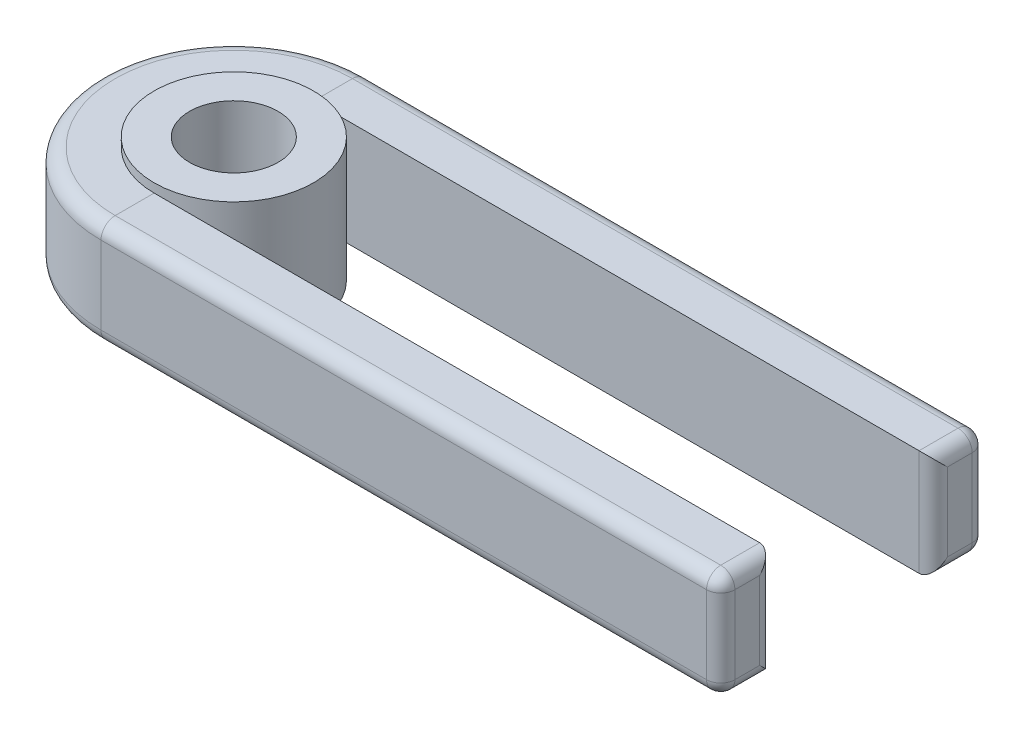
ISO-10303-21;
HEADER;
FILE_DESCRIPTION(('STEP AP214'),'2;1');
FILE_NAME('part.step','',(''),(''),'','','');
FILE_SCHEMA(('AUTOMOTIVE_DESIGN { 1 0 10303 214 1 1 1 1 }'));
ENDSEC;
DATA;
#1=APPLICATION_CONTEXT('core data for automotive mechanical design processes');
#2=APPLICATION_PROTOCOL_DEFINITION('international standard','automotive_design',2000,#1);
#3=PRODUCT_CONTEXT('',#1,'mechanical');
#4=PRODUCT('Part','Part','',(#3));
#5=PRODUCT_RELATED_PRODUCT_CATEGORY('part','',(#4));
#6=PRODUCT_DEFINITION_FORMATION('','',#4);
#7=PRODUCT_DEFINITION_CONTEXT('part definition',#1,'design');
#8=PRODUCT_DEFINITION('design','',#6,#7);
#9=PRODUCT_DEFINITION_SHAPE('','',#8);
#10=(LENGTH_UNIT() NAMED_UNIT(*) SI_UNIT(.MILLI.,.METRE.));
#11=(NAMED_UNIT(*) PLANE_ANGLE_UNIT() SI_UNIT($,.RADIAN.));
#12=(NAMED_UNIT(*) SI_UNIT($,.STERADIAN.) SOLID_ANGLE_UNIT());
#13=UNCERTAINTY_MEASURE_WITH_UNIT(LENGTH_MEASURE(1.E-05),#10,'distance_accuracy_value','');
#14=(GEOMETRIC_REPRESENTATION_CONTEXT(3) GLOBAL_UNCERTAINTY_ASSIGNED_CONTEXT((#13)) GLOBAL_UNIT_ASSIGNED_CONTEXT((#10,
#11,#12)) REPRESENTATION_CONTEXT('',''));
#15=CARTESIAN_POINT('',(0.,0.,0.));
#16=DIRECTION('',(0.,0.,1.));
#17=DIRECTION('',(1.,0.,0.));
#18=AXIS2_PLACEMENT_3D('',#15,#16,#17);
#19=CARTESIAN_POINT('',(0.,7.,0.));
#20=DIRECTION('',(0.,-1.,0.));
#21=DIRECTION('',(0.,0.,-1.));
#22=AXIS2_PLACEMENT_3D('',#19,#20,#21);
#23=CYLINDRICAL_SURFACE('',#22,4.5);
#24=CARTESIAN_POINT('',(0.,6.5,0.));
#25=DIRECTION('',(0.,-1.,0.));
#26=DIRECTION('',(0.,0.,1.));
#27=AXIS2_PLACEMENT_3D('',#24,#25,#26);
#28=CIRCLE('',#27,4.5);
#29=CARTESIAN_POINT('',(0.,6.5,4.5));
#30=VERTEX_POINT('',#29);
#31=CARTESIAN_POINT('',(0.,6.5,-4.5));
#32=VERTEX_POINT('',#31);
#33=EDGE_CURVE('E183',#30,#32,#28,.T.);
#34=ORIENTED_EDGE('',*,*,#33,.F.);
#35=DIRECTION('',(0.,-1.,0.));
#36=VECTOR('',#35,1.);
#37=CARTESIAN_POINT('',(0.,6.5,4.5));
#38=LINE('',#37,#36);
#39=CARTESIAN_POINT('',(0.,0.5,4.5));
#40=VERTEX_POINT('',#39);
#41=EDGE_CURVE('E155',#30,#40,#38,.T.);
#42=ORIENTED_EDGE('',*,*,#41,.T.);
#43=CARTESIAN_POINT('',(0.,0.5,0.));
#44=DIRECTION('',(0.,-1.,0.));
#45=DIRECTION('',(0.,0.,1.));
#46=AXIS2_PLACEMENT_3D('',#43,#44,#45);
#47=CIRCLE('',#46,4.5);
#48=CARTESIAN_POINT('',(0.,0.5,-4.5));
#49=VERTEX_POINT('',#48);
#50=EDGE_CURVE('E147',#40,#49,#47,.T.);
#51=ORIENTED_EDGE('',*,*,#50,.T.);
#52=DIRECTION('',(0.,-1.,0.));
#53=VECTOR('',#52,1.);
#54=CARTESIAN_POINT('',(0.,6.5,-4.5));
#55=LINE('',#54,#53);
#56=EDGE_CURVE('E152',#32,#49,#55,.T.);
#57=ORIENTED_EDGE('',*,*,#56,.F.);
#58=EDGE_LOOP('',(#34,#42,#51,#57));
#59=FACE_BOUND('',#58,.T.);
#60=CARTESIAN_POINT('',(0.,7.,0.));
#61=DIRECTION('',(0.,1.,0.));
#62=DIRECTION('',(0.,0.,1.));
#63=AXIS2_PLACEMENT_3D('',#60,#61,#62);
#64=CIRCLE('',#63,4.5);
#65=CARTESIAN_POINT('',(0.,7.,4.5));
#66=VERTEX_POINT('',#65);
#67=EDGE_CURVE('E209',#66,#66,#64,.T.);
#68=ORIENTED_EDGE('',*,*,#67,.F.);
#69=EDGE_LOOP('',(#68));
#70=FACE_BOUND('',#69,.T.);
#71=CARTESIAN_POINT('',(0.,0.,0.));
#72=DIRECTION('',(0.,1.,0.));
#73=DIRECTION('',(0.,0.,1.));
#74=AXIS2_PLACEMENT_3D('',#71,#72,#73);
#75=CIRCLE('',#74,4.5);
#76=CARTESIAN_POINT('',(0.,0.,4.5));
#77=VERTEX_POINT('',#76);
#78=EDGE_CURVE('E206',#77,#77,#75,.T.);
#79=ORIENTED_EDGE('',*,*,#78,.T.);
#80=EDGE_LOOP('',(#79));
#81=FACE_BOUND('',#80,.T.);
#82=ADVANCED_FACE('F33',(#59,#70,#81),#23,.T.);
#83=CARTESIAN_POINT('',(0.,7.,0.));
#84=DIRECTION('',(0.,1.,0.));
#85=DIRECTION('',(0.,0.,1.));
#86=AXIS2_PLACEMENT_3D('',#83,#84,#85);
#87=PLANE('',#86);
#88=CARTESIAN_POINT('',(0.,7.,0.));
#89=DIRECTION('',(0.,1.,0.));
#90=DIRECTION('',(0.,0.,1.));
#91=AXIS2_PLACEMENT_3D('',#88,#89,#90);
#92=CIRCLE('',#91,2.5);
#93=CARTESIAN_POINT('',(0.,7.,2.5));
#94=VERTEX_POINT('',#93);
#95=EDGE_CURVE('E172',#94,#94,#92,.T.);
#96=ORIENTED_EDGE('',*,*,#95,.F.);
#97=EDGE_LOOP('',(#96));
#98=FACE_BOUND('',#97,.T.);
#99=ORIENTED_EDGE('',*,*,#67,.T.);
#100=EDGE_LOOP('',(#99));
#101=FACE_BOUND('',#100,.T.);
#102=ADVANCED_FACE('F433',(#98,#101),#87,.T.);
#103=CARTESIAN_POINT('',(0.,0.,0.));
#104=DIRECTION('',(0.,1.,0.));
#105=DIRECTION('',(0.,0.,1.));
#106=AXIS2_PLACEMENT_3D('',#103,#104,#105);
#107=PLANE('',#106);
#108=CARTESIAN_POINT('',(0.,0.,0.));
#109=DIRECTION('',(0.,1.,0.));
#110=DIRECTION('',(0.,0.,1.));
#111=AXIS2_PLACEMENT_3D('',#108,#109,#110);
#112=CIRCLE('',#111,2.5);
#113=CARTESIAN_POINT('',(0.,0.,2.5));
#114=VERTEX_POINT('',#113);
#115=EDGE_CURVE('E203',#114,#114,#112,.T.);
#116=ORIENTED_EDGE('',*,*,#115,.T.);
#117=EDGE_LOOP('',(#116));
#118=FACE_BOUND('',#117,.T.);
#119=ORIENTED_EDGE('',*,*,#78,.F.);
#120=EDGE_LOOP('',(#119));
#121=FACE_BOUND('',#120,.T.);
#122=ADVANCED_FACE('F438',(#118,#121),#107,.F.);
#123=CARTESIAN_POINT('',(0.,0.,0.));
#124=DIRECTION('',(0.,1.,0.));
#125=DIRECTION('',(0.,0.,1.));
#126=AXIS2_PLACEMENT_3D('',#123,#124,#125);
#127=CYLINDRICAL_SURFACE('',#126,2.5);
#128=CARTESIAN_POINT('',(0.,0.,2.5));
#129=CARTESIAN_POINT('',(0.,0.0729166666666667,2.5));
#130=CARTESIAN_POINT('',(0.,0.145833333333333,2.5));
#131=CARTESIAN_POINT('',(0.,0.291666666666667,2.5));
#132=CARTESIAN_POINT('',(0.,0.364583333333333,2.5));
#133=CARTESIAN_POINT('',(0.,0.510416666666667,2.5));
#134=CARTESIAN_POINT('',(0.,0.583333333333333,2.5));
#135=CARTESIAN_POINT('',(0.,0.729166666666667,2.5));
#136=CARTESIAN_POINT('',(0.,0.802083333333333,2.5));
#137=CARTESIAN_POINT('',(0.,0.947916666666666,2.5));
#138=CARTESIAN_POINT('',(0.,1.02083333333333,2.5));
#139=CARTESIAN_POINT('',(0.,1.16666666666667,2.5));
#140=CARTESIAN_POINT('',(0.,1.23958333333333,2.5));
#141=CARTESIAN_POINT('',(0.,1.38541666666667,2.5));
#142=CARTESIAN_POINT('',(0.,1.45833333333333,2.5));
#143=CARTESIAN_POINT('',(0.,1.60416666666667,2.5));
#144=CARTESIAN_POINT('',(0.,1.67708333333333,2.5));
#145=CARTESIAN_POINT('',(0.,1.82291666666667,2.5));
#146=CARTESIAN_POINT('',(0.,1.89583333333333,2.5));
#147=CARTESIAN_POINT('',(0.,2.04166666666667,2.5));
#148=CARTESIAN_POINT('',(0.,2.11458333333333,2.5));
#149=CARTESIAN_POINT('',(0.,2.26041666666667,2.5));
#150=CARTESIAN_POINT('',(0.,2.33333333333333,2.5));
#151=CARTESIAN_POINT('',(0.,2.47916666666667,2.5));
#152=CARTESIAN_POINT('',(0.,2.55208333333333,2.5));
#153=CARTESIAN_POINT('',(0.,2.69791666666667,2.5));
#154=CARTESIAN_POINT('',(0.,2.77083333333333,2.5));
#155=CARTESIAN_POINT('',(0.,2.91666666666667,2.5));
#156=CARTESIAN_POINT('',(0.,2.98958333333333,2.5));
#157=CARTESIAN_POINT('',(0.,3.13541666666667,2.5));
#158=CARTESIAN_POINT('',(0.,3.20833333333333,2.5));
#159=CARTESIAN_POINT('',(0.,3.35416666666667,2.5));
#160=CARTESIAN_POINT('',(0.,3.42708333333333,2.5));
#161=CARTESIAN_POINT('',(0.,3.57291666666667,2.5));
#162=CARTESIAN_POINT('',(0.,3.64583333333333,2.5));
#163=CARTESIAN_POINT('',(0.,3.79166666666667,2.5));
#164=CARTESIAN_POINT('',(0.,3.86458333333333,2.5));
#165=CARTESIAN_POINT('',(0.,4.01041666666667,2.5));
#166=CARTESIAN_POINT('',(0.,4.08333333333333,2.5));
#167=CARTESIAN_POINT('',(0.,4.22916666666667,2.5));
#168=CARTESIAN_POINT('',(0.,4.30208333333333,2.5));
#169=CARTESIAN_POINT('',(0.,4.44791666666667,2.5));
#170=CARTESIAN_POINT('',(0.,4.52083333333333,2.5));
#171=CARTESIAN_POINT('',(0.,4.66666666666667,2.5));
#172=CARTESIAN_POINT('',(0.,4.73958333333333,2.5));
#173=CARTESIAN_POINT('',(0.,4.88541666666666,2.5));
#174=CARTESIAN_POINT('',(0.,4.95833333333333,2.5));
#175=CARTESIAN_POINT('',(0.,5.10416666666667,2.5));
#176=CARTESIAN_POINT('',(0.,5.17708333333333,2.5));
#177=CARTESIAN_POINT('',(0.,5.32291666666667,2.5));
#178=CARTESIAN_POINT('',(0.,5.39583333333333,2.5));
#179=CARTESIAN_POINT('',(0.,5.54166666666667,2.5));
#180=CARTESIAN_POINT('',(0.,5.61458333333333,2.5));
#181=CARTESIAN_POINT('',(0.,5.76041666666667,2.5));
#182=CARTESIAN_POINT('',(0.,5.83333333333333,2.5));
#183=CARTESIAN_POINT('',(0.,5.97916666666667,2.5));
#184=CARTESIAN_POINT('',(0.,6.05208333333333,2.5));
#185=CARTESIAN_POINT('',(0.,6.19791666666667,2.5));
#186=CARTESIAN_POINT('',(0.,6.27083333333333,2.5));
#187=CARTESIAN_POINT('',(0.,6.41666666666667,2.5));
#188=CARTESIAN_POINT('',(0.,6.48958333333333,2.5));
#189=CARTESIAN_POINT('',(0.,6.63541666666666,2.5));
#190=CARTESIAN_POINT('',(0.,6.70833333333333,2.5));
#191=CARTESIAN_POINT('',(0.,6.85416666666666,2.5));
#192=CARTESIAN_POINT('',(0.,6.92708333333333,2.5));
#193=CARTESIAN_POINT('',(0.,7.,2.5));
#194=B_SPLINE_CURVE_WITH_KNOTS('',3,(#128,#129,#130,#131,#132,#133,#134,#135,#136,#137,#138,
#139,#140,#141,#142,#143,#144,#145,#146,#147,#148,#149,#150,#151,#152,#153,#154,#155,#156,#157,
#158,#159,#160,#161,#162,#163,#164,#165,#166,#167,#168,#169,#170,#171,#172,#173,#174,#175,#176,
#177,#178,#179,#180,#181,#182,#183,#184,#185,#186,#187,#188,#189,#190,#191,#192,#193),
.UNSPECIFIED.,.F.,.F.,(4,2,2,2,2,2,2,2,2,2,2,2,2,2,2,2,2,2,2,2,2,2,2,2,2,2,2,2,2,2,2,2,4),(0.,
0.21875,0.4375,0.65625,0.875,1.09375,1.3125,1.53125,1.75,1.96875,2.1875,2.40625,2.625,2.84375,
3.0625,3.28125,3.5,3.71875,3.9375,4.15625,4.375,4.59375,4.8125,5.03125,5.25,5.46875,5.6875,
5.90625,6.125,6.34375,6.5625,6.78125,7.),.UNSPECIFIED.);
#195=EDGE_CURVE('BSEAM428',#114,#94,#194,.T.);
#196=ORIENTED_EDGE('',*,*,#115,.F.);
#197=ORIENTED_EDGE('',*,*,#95,.T.);
#198=ORIENTED_EDGE('',*,*,#195,.T.);
#199=ORIENTED_EDGE('',*,*,#195,.F.);
#200=EDGE_LOOP('',(#196,#198,#197,#199));
#201=FACE_BOUND('',#200,.T.);
#202=ADVANCED_FACE('F428',(#201),#127,.F.);
#203=CARTESIAN_POINT('',(35.,0.,0.));
#204=DIRECTION('',(-1.,0.,0.));
#205=DIRECTION('',(0.,0.,1.));
#206=AXIS2_PLACEMENT_3D('',#203,#204,#205);
#207=PLANE('',#206);
#208=DIRECTION('',(0.,-1.,0.));
#209=VECTOR('',#208,1.);
#210=CARTESIAN_POINT('',(35.,6.5,5.3));
#211=LINE('',#210,#209);
#212=CARTESIAN_POINT('',(35.,1.3,5.3));
#213=VERTEX_POINT('',#212);
#214=CARTESIAN_POINT('',(35.,5.7,5.3));
#215=VERTEX_POINT('',#214);
#216=EDGE_CURVE('E241',#213,#215,#211,.F.);
#217=ORIENTED_EDGE('',*,*,#216,.T.);
#218=DIRECTION('',(0.,0.,-1.));
#219=VECTOR('',#218,1.);
#220=CARTESIAN_POINT('',(35.,5.7,7.5));
#221=LINE('',#220,#219);
#222=CARTESIAN_POINT('',(35.,5.7,6.7));
#223=VERTEX_POINT('',#222);
#224=EDGE_CURVE('E243',#215,#223,#221,.F.);
#225=ORIENTED_EDGE('',*,*,#224,.T.);
#226=DIRECTION('',(0.,1.,0.));
#227=VECTOR('',#226,1.);
#228=CARTESIAN_POINT('',(35.,0.5,6.7));
#229=LINE('',#228,#227);
#230=CARTESIAN_POINT('',(35.,1.3,6.7));
#231=VERTEX_POINT('',#230);
#232=EDGE_CURVE('E237',#223,#231,#229,.F.);
#233=ORIENTED_EDGE('',*,*,#232,.T.);
#234=DIRECTION('',(0.,0.,1.));
#235=VECTOR('',#234,1.);
#236=CARTESIAN_POINT('',(35.,1.3,4.5));
#237=LINE('',#236,#235);
#238=EDGE_CURVE('E239',#231,#213,#237,.F.);
#239=ORIENTED_EDGE('',*,*,#238,.T.);
#240=EDGE_LOOP('',(#217,#225,#233,#239));
#241=FACE_BOUND('',#240,.T.);
#242=ADVANCED_FACE('F411',(#241),#207,.F.);
#243=CARTESIAN_POINT('',(35.,0.,0.));
#244=DIRECTION('',(1.,0.,0.));
#245=DIRECTION('',(0.,0.,-1.));
#246=AXIS2_PLACEMENT_3D('',#243,#244,#245);
#247=PLANE('',#246);
#248=DIRECTION('',(0.,-1.,0.));
#249=VECTOR('',#248,1.);
#250=CARTESIAN_POINT('',(35.,0.,-5.3));
#251=LINE('',#250,#249);
#252=CARTESIAN_POINT('',(35.,5.7,-5.3));
#253=VERTEX_POINT('',#252);
#254=CARTESIAN_POINT('',(35.,1.3,-5.3));
#255=VERTEX_POINT('',#254);
#256=EDGE_CURVE('E252',#253,#255,#251,.T.);
#257=ORIENTED_EDGE('',*,*,#256,.T.);
#258=DIRECTION('',(0.,0.,-1.));
#259=VECTOR('',#258,1.);
#260=CARTESIAN_POINT('',(35.,1.3,0.));
#261=LINE('',#260,#259);
#262=CARTESIAN_POINT('',(35.,1.3,-6.7));
#263=VERTEX_POINT('',#262);
#264=EDGE_CURVE('E254',#255,#263,#261,.T.);
#265=ORIENTED_EDGE('',*,*,#264,.T.);
#266=DIRECTION('',(0.,1.,0.));
#267=VECTOR('',#266,1.);
#268=CARTESIAN_POINT('',(35.,0.,-6.7));
#269=LINE('',#268,#267);
#270=CARTESIAN_POINT('',(35.,5.7,-6.7));
#271=VERTEX_POINT('',#270);
#272=EDGE_CURVE('E248',#263,#271,#269,.T.);
#273=ORIENTED_EDGE('',*,*,#272,.T.);
#274=DIRECTION('',(0.,0.,1.));
#275=VECTOR('',#274,1.);
#276=CARTESIAN_POINT('',(35.,5.7,0.));
#277=LINE('',#276,#275);
#278=EDGE_CURVE('E250',#271,#253,#277,.T.);
#279=ORIENTED_EDGE('',*,*,#278,.T.);
#280=EDGE_LOOP('',(#257,#265,#273,#279));
#281=FACE_BOUND('',#280,.T.);
#282=ADVANCED_FACE('F378',(#281),#247,.T.);
#283=CARTESIAN_POINT('',(35.,6.5,4.5));
#284=DIRECTION('',(0.,0.,-1.));
#285=DIRECTION('',(0.,1.,0.));
#286=AXIS2_PLACEMENT_3D('',#283,#284,#285);
#287=PLANE('',#286);
#288=DIRECTION('',(-1.,0.,0.));
#289=VECTOR('',#288,1.);
#290=CARTESIAN_POINT('',(35.,6.5,4.5));
#291=LINE('',#290,#289);
#292=CARTESIAN_POINT('',(34.2,6.5,4.5));
#293=VERTEX_POINT('',#292);
#294=EDGE_CURVE('E188',#293,#30,#291,.T.);
#295=ORIENTED_EDGE('',*,*,#294,.F.);
#296=DIRECTION('',(0.,-1.,0.));
#297=VECTOR('',#296,1.);
#298=CARTESIAN_POINT('',(34.2,0.499999999999999,4.5));
#299=LINE('',#298,#297);
#300=CARTESIAN_POINT('',(34.2,0.5,4.5));
#301=VERTEX_POINT('',#300);
#302=EDGE_CURVE('E246',#293,#301,#299,.T.);
#303=ORIENTED_EDGE('',*,*,#302,.T.);
#304=DIRECTION('',(-1.,0.,0.));
#305=VECTOR('',#304,1.);
#306=CARTESIAN_POINT('',(35.,0.5,4.5));
#307=LINE('',#306,#305);
#308=EDGE_CURVE('E195',#301,#40,#307,.T.);
#309=ORIENTED_EDGE('',*,*,#308,.T.);
#310=ORIENTED_EDGE('',*,*,#41,.F.);
#311=EDGE_LOOP('',(#295,#303,#309,#310));
#312=FACE_BOUND('',#311,.T.);
#313=ADVANCED_FACE('F334',(#312),#287,.T.);
#314=CARTESIAN_POINT('',(35.,0.5,4.5));
#315=DIRECTION('',(0.,-1.,0.));
#316=DIRECTION('',(0.,0.,-1.));
#317=AXIS2_PLACEMENT_3D('',#314,#315,#316);
#318=PLANE('',#317);
#319=DIRECTION('',(0.,0.,1.));
#320=VECTOR('',#319,1.);
#321=CARTESIAN_POINT('',(34.2,0.5,7.5));
#322=LINE('',#321,#320);
#323=CARTESIAN_POINT('',(34.2,0.5,6.7));
#324=VERTEX_POINT('',#323);
#325=EDGE_CURVE('E212',#301,#324,#322,.T.);
#326=ORIENTED_EDGE('',*,*,#325,.T.);
#327=DIRECTION('',(-1.,0.,0.));
#328=VECTOR('',#327,1.);
#329=CARTESIAN_POINT('',(35.,0.5,6.7));
#330=LINE('',#329,#328);
#331=CARTESIAN_POINT('',(0.,0.5,6.7));
#332=VERTEX_POINT('',#331);
#333=EDGE_CURVE('E216',#324,#332,#330,.T.);
#334=ORIENTED_EDGE('',*,*,#333,.T.);
#335=DIRECTION('',(0.,0.,1.));
#336=VECTOR('',#335,1.);
#337=CARTESIAN_POINT('',(0.,0.5,4.5));
#338=LINE('',#337,#336);
#339=EDGE_CURVE('E193',#40,#332,#338,.T.);
#340=ORIENTED_EDGE('',*,*,#339,.F.);
#341=ORIENTED_EDGE('',*,*,#308,.F.);
#342=EDGE_LOOP('',(#326,#334,#340,#341));
#343=FACE_BOUND('',#342,.T.);
#344=ADVANCED_FACE('F338',(#343),#318,.T.);
#345=CARTESIAN_POINT('',(35.,6.5,7.5));
#346=DIRECTION('',(0.,0.,1.));
#347=DIRECTION('',(0.,-1.,0.));
#348=AXIS2_PLACEMENT_3D('',#345,#346,#347);
#349=PLANE('',#348);
#350=DIRECTION('',(0.,1.,0.));
#351=VECTOR('',#350,1.);
#352=CARTESIAN_POINT('',(0.,6.5,7.5));
#353=LINE('',#352,#351);
#354=CARTESIAN_POINT('',(0.,1.3,7.5));
#355=VERTEX_POINT('',#354);
#356=CARTESIAN_POINT('',(0.,5.7,7.5));
#357=VERTEX_POINT('',#356);
#358=EDGE_CURVE('E194',#355,#357,#353,.T.);
#359=ORIENTED_EDGE('',*,*,#358,.F.);
#360=DIRECTION('',(-1.,0.,0.));
#361=VECTOR('',#360,1.);
#362=CARTESIAN_POINT('',(35.,1.3,7.5));
#363=LINE('',#362,#361);
#364=CARTESIAN_POINT('',(34.2,1.3,7.5));
#365=VERTEX_POINT('',#364);
#366=EDGE_CURVE('E223',#355,#365,#363,.F.);
#367=ORIENTED_EDGE('',*,*,#366,.T.);
#368=DIRECTION('',(0.,1.,0.));
#369=VECTOR('',#368,1.);
#370=CARTESIAN_POINT('',(34.2,6.5,7.5));
#371=LINE('',#370,#369);
#372=CARTESIAN_POINT('',(34.2,5.7,7.5));
#373=VERTEX_POINT('',#372);
#374=EDGE_CURVE('E219',#365,#373,#371,.T.);
#375=ORIENTED_EDGE('',*,*,#374,.T.);
#376=DIRECTION('',(-1.,0.,0.));
#377=VECTOR('',#376,1.);
#378=CARTESIAN_POINT('',(35.,5.7,7.5));
#379=LINE('',#378,#377);
#380=EDGE_CURVE('E221',#373,#357,#379,.T.);
#381=ORIENTED_EDGE('',*,*,#380,.T.);
#382=EDGE_LOOP('',(#359,#367,#375,#381));
#383=FACE_BOUND('',#382,.T.);
#384=ADVANCED_FACE('F416',(#383),#349,.T.);
#385=CARTESIAN_POINT('',(35.,6.5,4.5));
#386=DIRECTION('',(0.,1.,0.));
#387=DIRECTION('',(0.,0.,1.));
#388=AXIS2_PLACEMENT_3D('',#385,#386,#387);
#389=PLANE('',#388);
#390=DIRECTION('',(0.,0.,-1.));
#391=VECTOR('',#390,1.);
#392=CARTESIAN_POINT('',(0.,6.5,4.5));
#393=LINE('',#392,#391);
#394=CARTESIAN_POINT('',(0.,6.5,6.7));
#395=VERTEX_POINT('',#394);
#396=EDGE_CURVE('E185',#395,#30,#393,.T.);
#397=ORIENTED_EDGE('',*,*,#396,.F.);
#398=DIRECTION('',(-1.,0.,0.));
#399=VECTOR('',#398,1.);
#400=CARTESIAN_POINT('',(35.,6.5,6.7));
#401=LINE('',#400,#399);
#402=CARTESIAN_POINT('',(34.2,6.5,6.7));
#403=VERTEX_POINT('',#402);
#404=EDGE_CURVE('E233',#395,#403,#401,.F.);
#405=ORIENTED_EDGE('',*,*,#404,.T.);
#406=DIRECTION('',(0.,0.,-1.));
#407=VECTOR('',#406,1.);
#408=CARTESIAN_POINT('',(34.2,6.5,4.5));
#409=LINE('',#408,#407);
#410=EDGE_CURVE('E231',#403,#293,#409,.T.);
#411=ORIENTED_EDGE('',*,*,#410,.T.);
#412=ORIENTED_EDGE('',*,*,#294,.T.);
#413=EDGE_LOOP('',(#397,#405,#411,#412));
#414=FACE_BOUND('',#413,.T.);
#415=ADVANCED_FACE('F394',(#414),#389,.T.);
#416=CARTESIAN_POINT('',(0.,0.5,4.5));
#417=DIRECTION('',(0.,-1.,0.));
#418=DIRECTION('',(0.,0.,-1.));
#419=AXIS2_PLACEMENT_3D('',#416,#417,#418);
#420=PLANE('',#419);
#421=ORIENTED_EDGE('',*,*,#339,.T.);
#422=CARTESIAN_POINT('',(0.,0.5,0.));
#423=DIRECTION('',(0.,-1.,0.));
#424=DIRECTION('',(0.,0.,-1.));
#425=AXIS2_PLACEMENT_3D('',#422,#423,#424);
#426=CIRCLE('',#425,6.7);
#427=CARTESIAN_POINT('',(0.,0.5,-6.7));
#428=VERTEX_POINT('',#427);
#429=EDGE_CURVE('E177',#332,#428,#426,.T.);
#430=ORIENTED_EDGE('',*,*,#429,.T.);
#431=DIRECTION('',(0.,0.,-1.));
#432=VECTOR('',#431,1.);
#433=CARTESIAN_POINT('',(0.,0.5,-4.5));
#434=LINE('',#433,#432);
#435=EDGE_CURVE('E160',#49,#428,#434,.T.);
#436=ORIENTED_EDGE('',*,*,#435,.F.);
#437=ORIENTED_EDGE('',*,*,#50,.F.);
#438=EDGE_LOOP('',(#421,#430,#436,#437));
#439=FACE_BOUND('',#438,.T.);
#440=ADVANCED_FACE('F175',(#439),#420,.T.);
#441=CARTESIAN_POINT('',(0.,3.5,0.));
#442=DIRECTION('',(0.,-1.,0.));
#443=DIRECTION('',(0.,0.,-1.));
#444=AXIS2_PLACEMENT_3D('',#441,#442,#443);
#445=CYLINDRICAL_SURFACE('',#444,7.5);
#446=DIRECTION('',(0.,1.,0.));
#447=VECTOR('',#446,1.);
#448=CARTESIAN_POINT('',(0.,6.5,-7.5));
#449=LINE('',#448,#447);
#450=CARTESIAN_POINT('',(0.,1.3,-7.5));
#451=VERTEX_POINT('',#450);
#452=CARTESIAN_POINT('',(0.,5.7,-7.5));
#453=VERTEX_POINT('',#452);
#454=EDGE_CURVE('E178',#451,#453,#449,.T.);
#455=ORIENTED_EDGE('',*,*,#454,.F.);
#456=CARTESIAN_POINT('',(0.,1.3,0.));
#457=DIRECTION('',(0.,-1.,0.));
#458=DIRECTION('',(0.,0.,-1.));
#459=AXIS2_PLACEMENT_3D('',#456,#457,#458);
#460=CIRCLE('',#459,7.5);
#461=EDGE_CURVE('E229',#451,#355,#460,.F.);
#462=ORIENTED_EDGE('',*,*,#461,.T.);
#463=ORIENTED_EDGE('',*,*,#358,.T.);
#464=CARTESIAN_POINT('',(0.,5.7,0.));
#465=DIRECTION('',(0.,1.,0.));
#466=DIRECTION('',(0.,0.,1.));
#467=AXIS2_PLACEMENT_3D('',#464,#465,#466);
#468=CIRCLE('',#467,7.5);
#469=EDGE_CURVE('E227',#357,#453,#468,.F.);
#470=ORIENTED_EDGE('',*,*,#469,.T.);
#471=EDGE_LOOP('',(#455,#462,#463,#470));
#472=FACE_BOUND('',#471,.T.);
#473=ADVANCED_FACE('F419',(#472),#445,.T.);
#474=CARTESIAN_POINT('',(0.,6.5,4.5));
#475=DIRECTION('',(0.,1.,0.));
#476=DIRECTION('',(0.,0.,1.));
#477=AXIS2_PLACEMENT_3D('',#474,#475,#476);
#478=PLANE('',#477);
#479=DIRECTION('',(0.,0.,1.));
#480=VECTOR('',#479,1.);
#481=CARTESIAN_POINT('',(0.,6.5,-4.5));
#482=LINE('',#481,#480);
#483=CARTESIAN_POINT('',(0.,6.5,-6.7));
#484=VERTEX_POINT('',#483);
#485=EDGE_CURVE('E192',#484,#32,#482,.T.);
#486=ORIENTED_EDGE('',*,*,#485,.F.);
#487=CARTESIAN_POINT('',(0.,6.5,0.));
#488=DIRECTION('',(0.,1.,0.));
#489=DIRECTION('',(0.,0.,1.));
#490=AXIS2_PLACEMENT_3D('',#487,#488,#489);
#491=CIRCLE('',#490,6.7);
#492=EDGE_CURVE('E235',#484,#395,#491,.T.);
#493=ORIENTED_EDGE('',*,*,#492,.T.);
#494=ORIENTED_EDGE('',*,*,#396,.T.);
#495=ORIENTED_EDGE('',*,*,#33,.T.);
#496=EDGE_LOOP('',(#486,#493,#494,#495));
#497=FACE_BOUND('',#496,.T.);
#498=ADVANCED_FACE('F392',(#497),#478,.T.);
#499=CARTESIAN_POINT('',(0.,6.5,-4.5));
#500=DIRECTION('',(0.,0.,1.));
#501=DIRECTION('',(0.,-1.,0.));
#502=AXIS2_PLACEMENT_3D('',#499,#500,#501);
#503=PLANE('',#502);
#504=DIRECTION('',(1.,0.,0.));
#505=VECTOR('',#504,1.);
#506=CARTESIAN_POINT('',(0.,0.5,-4.5));
#507=LINE('',#506,#505);
#508=CARTESIAN_POINT('',(34.2,0.5,-4.5));
#509=VERTEX_POINT('',#508);
#510=EDGE_CURVE('E165',#49,#509,#507,.T.);
#511=ORIENTED_EDGE('',*,*,#510,.T.);
#512=DIRECTION('',(0.,-1.,0.));
#513=VECTOR('',#512,1.);
#514=CARTESIAN_POINT('',(34.2,6.5,-4.5));
#515=LINE('',#514,#513);
#516=CARTESIAN_POINT('',(34.2,6.5,-4.5));
#517=VERTEX_POINT('',#516);
#518=EDGE_CURVE('E260',#509,#517,#515,.F.);
#519=ORIENTED_EDGE('',*,*,#518,.T.);
#520=DIRECTION('',(1.,0.,0.));
#521=VECTOR('',#520,1.);
#522=CARTESIAN_POINT('',(0.,6.5,-4.5));
#523=LINE('',#522,#521);
#524=EDGE_CURVE('E173',#32,#517,#523,.T.);
#525=ORIENTED_EDGE('',*,*,#524,.F.);
#526=ORIENTED_EDGE('',*,*,#56,.T.);
#527=EDGE_LOOP('',(#511,#519,#525,#526));
#528=FACE_BOUND('',#527,.T.);
#529=ADVANCED_FACE('F180',(#528),#503,.T.);
#530=CARTESIAN_POINT('',(0.,0.5,-4.5));
#531=DIRECTION('',(0.,-1.,0.));
#532=DIRECTION('',(0.,0.,-1.));
#533=AXIS2_PLACEMENT_3D('',#530,#531,#532);
#534=PLANE('',#533);
#535=DIRECTION('',(1.,0.,0.));
#536=VECTOR('',#535,1.);
#537=CARTESIAN_POINT('',(0.,0.5,-6.7));
#538=LINE('',#537,#536);
#539=CARTESIAN_POINT('',(34.2,0.5,-6.7));
#540=VERTEX_POINT('',#539);
#541=EDGE_CURVE('E257',#428,#540,#538,.T.);
#542=ORIENTED_EDGE('',*,*,#541,.T.);
#543=DIRECTION('',(0.,0.,-1.));
#544=VECTOR('',#543,1.);
#545=CARTESIAN_POINT('',(34.2,0.5,-4.5));
#546=LINE('',#545,#544);
#547=EDGE_CURVE('E169',#540,#509,#546,.F.);
#548=ORIENTED_EDGE('',*,*,#547,.T.);
#549=ORIENTED_EDGE('',*,*,#510,.F.);
#550=ORIENTED_EDGE('',*,*,#435,.T.);
#551=EDGE_LOOP('',(#542,#548,#549,#550));
#552=FACE_BOUND('',#551,.T.);
#553=ADVANCED_FACE('F166',(#552),#534,.T.);
#554=CARTESIAN_POINT('',(0.,6.5,-7.5));
#555=DIRECTION('',(0.,0.,-1.));
#556=DIRECTION('',(0.,1.,0.));
#557=AXIS2_PLACEMENT_3D('',#554,#555,#556);
#558=PLANE('',#557);
#559=DIRECTION('',(0.,1.,0.));
#560=VECTOR('',#559,1.);
#561=CARTESIAN_POINT('',(34.2,6.5,-7.5));
#562=LINE('',#561,#560);
#563=CARTESIAN_POINT('',(34.2,5.7,-7.5));
#564=VERTEX_POINT('',#563);
#565=CARTESIAN_POINT('',(34.2,1.3,-7.5));
#566=VERTEX_POINT('',#565);
#567=EDGE_CURVE('E42',#564,#566,#562,.F.);
#568=ORIENTED_EDGE('',*,*,#567,.T.);
#569=DIRECTION('',(1.,0.,0.));
#570=VECTOR('',#569,1.);
#571=CARTESIAN_POINT('',(0.,1.3,-7.5));
#572=LINE('',#571,#570);
#573=EDGE_CURVE('E11',#566,#451,#572,.F.);
#574=ORIENTED_EDGE('',*,*,#573,.T.);
#575=ORIENTED_EDGE('',*,*,#454,.T.);
#576=DIRECTION('',(1.,0.,0.));
#577=VECTOR('',#576,1.);
#578=CARTESIAN_POINT('',(0.,5.7,-7.5));
#579=LINE('',#578,#577);
#580=EDGE_CURVE('E53',#453,#564,#579,.T.);
#581=ORIENTED_EDGE('',*,*,#580,.T.);
#582=EDGE_LOOP('',(#568,#574,#575,#581));
#583=FACE_BOUND('',#582,.T.);
#584=ADVANCED_FACE('F420',(#583),#558,.T.);
#585=CARTESIAN_POINT('',(0.,6.5,-4.5));
#586=DIRECTION('',(0.,1.,0.));
#587=DIRECTION('',(0.,0.,1.));
#588=AXIS2_PLACEMENT_3D('',#585,#586,#587);
#589=PLANE('',#588);
#590=ORIENTED_EDGE('',*,*,#524,.T.);
#591=DIRECTION('',(0.,0.,1.));
#592=VECTOR('',#591,1.);
#593=CARTESIAN_POINT('',(34.2,6.5,-4.5));
#594=LINE('',#593,#592);
#595=CARTESIAN_POINT('',(34.2,6.5,-6.7));
#596=VERTEX_POINT('',#595);
#597=EDGE_CURVE('E264',#517,#596,#594,.F.);
#598=ORIENTED_EDGE('',*,*,#597,.T.);
#599=DIRECTION('',(1.,0.,0.));
#600=VECTOR('',#599,1.);
#601=CARTESIAN_POINT('',(0.,6.5,-6.7));
#602=LINE('',#601,#600);
#603=EDGE_CURVE('E262',#596,#484,#602,.F.);
#604=ORIENTED_EDGE('',*,*,#603,.T.);
#605=ORIENTED_EDGE('',*,*,#485,.T.);
#606=EDGE_LOOP('',(#590,#598,#604,#605));
#607=FACE_BOUND('',#606,.T.);
#608=ADVANCED_FACE('F382',(#607),#589,.T.);
#609=CARTESIAN_POINT('',(34.2,5.7,0.));
#610=DIRECTION('',(0.,0.,1.));
#611=DIRECTION('',(1.,0.,0.));
#612=AXIS2_PLACEMENT_3D('',#609,#610,#611);
#613=CYLINDRICAL_SURFACE('',#612,0.8);
#614=CARTESIAN_POINT('',(34.2,5.7,-6.7));
#615=DIRECTION('',(0.,0.,-1.));
#616=DIRECTION('',(-1.,0.,0.));
#617=AXIS2_PLACEMENT_3D('',#614,#615,#616);
#618=CIRCLE('',#617,0.8);
#619=EDGE_CURVE('E316',#596,#271,#618,.T.);
#620=ORIENTED_EDGE('',*,*,#619,.F.);
#621=ORIENTED_EDGE('',*,*,#597,.F.);
#622=CARTESIAN_POINT('',(34.2,5.7,-5.3));
#623=DIRECTION('',(0.,-0.707106781186548,0.707106781186547));
#624=DIRECTION('',(0.,0.707106781186547,0.707106781186548));
#625=AXIS2_PLACEMENT_3D('',#622,#623,#624);
#626=ELLIPSE('',#625,1.13137084989848,0.8);
#627=EDGE_CURVE('E318',#253,#517,#626,.T.);
#628=ORIENTED_EDGE('',*,*,#627,.F.);
#629=ORIENTED_EDGE('',*,*,#278,.F.);
#630=EDGE_LOOP('',(#620,#621,#628,#629));
#631=FACE_BOUND('',#630,.T.);
#632=ADVANCED_FACE('F35',(#631),#613,.T.);
#633=CARTESIAN_POINT('',(0.,5.7,-6.7));
#634=DIRECTION('',(1.,0.,0.));
#635=DIRECTION('',(0.,0.,-1.));
#636=AXIS2_PLACEMENT_3D('',#633,#634,#635);
#637=CYLINDRICAL_SURFACE('',#636,0.8);
#638=CARTESIAN_POINT('',(34.2,5.7,-6.7));
#639=DIRECTION('',(1.,0.,0.));
#640=DIRECTION('',(0.,0.,-1.));
#641=AXIS2_PLACEMENT_3D('',#638,#639,#640);
#642=CIRCLE('',#641,0.8);
#643=EDGE_CURVE('E313',#564,#596,#642,.T.);
#644=ORIENTED_EDGE('',*,*,#643,.F.);
#645=ORIENTED_EDGE('',*,*,#580,.F.);
#646=CARTESIAN_POINT('',(0.,5.7,-6.7));
#647=DIRECTION('',(-1.,0.,0.));
#648=DIRECTION('',(0.,0.,1.));
#649=AXIS2_PLACEMENT_3D('',#646,#647,#648);
#650=CIRCLE('',#649,0.8);
#651=EDGE_CURVE('E37',#484,#453,#650,.T.);
#652=ORIENTED_EDGE('',*,*,#651,.F.);
#653=ORIENTED_EDGE('',*,*,#603,.F.);
#654=EDGE_LOOP('',(#644,#645,#652,#653));
#655=FACE_BOUND('',#654,.T.);
#656=ADVANCED_FACE('F390',(#655),#637,.T.);
#657=CARTESIAN_POINT('',(0.,5.7,0.));
#658=DIRECTION('',(0.,1.,0.));
#659=DIRECTION('',(0.,0.,1.));
#660=AXIS2_PLACEMENT_3D('',#657,#658,#659);
#661=TOROIDAL_SURFACE('',#660,6.7,0.8);
#662=ORIENTED_EDGE('',*,*,#651,.T.);
#663=ORIENTED_EDGE('',*,*,#469,.F.);
#664=CARTESIAN_POINT('',(0.,5.7,6.7));
#665=DIRECTION('',(1.,0.,0.));
#666=DIRECTION('',(0.,0.,-1.));
#667=AXIS2_PLACEMENT_3D('',#664,#665,#666);
#668=CIRCLE('',#667,0.8);
#669=EDGE_CURVE('E310',#395,#357,#668,.T.);
#670=ORIENTED_EDGE('',*,*,#669,.F.);
#671=ORIENTED_EDGE('',*,*,#492,.F.);
#672=EDGE_LOOP('',(#662,#663,#670,#671));
#673=FACE_BOUND('',#672,.T.);
#674=ADVANCED_FACE('F397',(#673),#661,.T.);
#675=CARTESIAN_POINT('',(34.2,0.,-5.3));
#676=DIRECTION('',(0.,-1.,0.));
#677=DIRECTION('',(0.,0.,-1.));
#678=AXIS2_PLACEMENT_3D('',#675,#676,#677);
#679=CYLINDRICAL_SURFACE('',#678,0.8);
#680=ORIENTED_EDGE('',*,*,#627,.T.);
#681=ORIENTED_EDGE('',*,*,#518,.F.);
#682=CARTESIAN_POINT('',(34.2,1.3,-5.3));
#683=DIRECTION('',(0.,-0.707106781186547,-0.707106781186548));
#684=DIRECTION('',(0.,-0.707106781186548,0.707106781186547));
#685=AXIS2_PLACEMENT_3D('',#682,#683,#684);
#686=ELLIPSE('',#685,1.13137084989848,0.8);
#687=EDGE_CURVE('E307',#255,#509,#686,.T.);
#688=ORIENTED_EDGE('',*,*,#687,.F.);
#689=ORIENTED_EDGE('',*,*,#256,.F.);
#690=EDGE_LOOP('',(#680,#681,#688,#689));
#691=FACE_BOUND('',#690,.T.);
#692=ADVANCED_FACE('F379',(#691),#679,.T.);
#693=CARTESIAN_POINT('',(34.2,5.7,-6.7));
#694=DIRECTION('',(0.,1.,0.));
#695=DIRECTION('',(0.,0.,1.));
#696=AXIS2_PLACEMENT_3D('',#693,#694,#695);
#697=SPHERICAL_SURFACE('',#696,0.8);
#698=ORIENTED_EDGE('',*,*,#643,.T.);
#699=ORIENTED_EDGE('',*,*,#619,.T.);
#700=CARTESIAN_POINT('',(34.2,5.7,-6.7));
#701=DIRECTION('',(0.,1.,0.));
#702=DIRECTION('',(0.,0.,1.));
#703=AXIS2_PLACEMENT_3D('',#700,#701,#702);
#704=CIRCLE('',#703,0.8);
#705=EDGE_CURVE('E304',#564,#271,#704,.F.);
#706=ORIENTED_EDGE('',*,*,#705,.F.);
#707=EDGE_LOOP('',(#698,#699,#706));
#708=FACE_BOUND('',#707,.T.);
#709=ADVANCED_FACE('F388',(#708),#697,.T.);
#710=CARTESIAN_POINT('',(35.,5.7,6.7));
#711=DIRECTION('',(-1.,0.,0.));
#712=DIRECTION('',(0.,0.,1.));
#713=AXIS2_PLACEMENT_3D('',#710,#711,#712);
#714=CYLINDRICAL_SURFACE('',#713,0.8);
#715=ORIENTED_EDGE('',*,*,#669,.T.);
#716=ORIENTED_EDGE('',*,*,#380,.F.);
#717=CARTESIAN_POINT('',(34.2,5.7,6.7));
#718=DIRECTION('',(1.,0.,0.));
#719=DIRECTION('',(0.,0.,-1.));
#720=AXIS2_PLACEMENT_3D('',#717,#718,#719);
#721=CIRCLE('',#720,0.8);
#722=EDGE_CURVE('E301',#403,#373,#721,.T.);
#723=ORIENTED_EDGE('',*,*,#722,.F.);
#724=ORIENTED_EDGE('',*,*,#404,.F.);
#725=EDGE_LOOP('',(#715,#716,#723,#724));
#726=FACE_BOUND('',#725,.T.);
#727=ADVANCED_FACE('F401',(#726),#714,.T.);
#728=CARTESIAN_POINT('',(34.2,5.7,4.5));
#729=DIRECTION('',(0.,0.,1.));
#730=DIRECTION('',(1.,0.,0.));
#731=AXIS2_PLACEMENT_3D('',#728,#729,#730);
#732=CYLINDRICAL_SURFACE('',#731,0.8);
#733=CARTESIAN_POINT('',(34.2,5.7,5.3));
#734=DIRECTION('',(0.,0.707106781186548,0.707106781186547));
#735=DIRECTION('',(0.,0.707106781186547,-0.707106781186548));
#736=AXIS2_PLACEMENT_3D('',#733,#734,#735);
#737=ELLIPSE('',#736,1.13137084989848,0.8);
#738=EDGE_CURVE('E295',#293,#215,#737,.F.);
#739=ORIENTED_EDGE('',*,*,#738,.F.);
#740=ORIENTED_EDGE('',*,*,#410,.F.);
#741=CARTESIAN_POINT('',(34.2,5.7,6.7));
#742=DIRECTION('',(0.,0.,1.));
#743=DIRECTION('',(1.,0.,0.));
#744=AXIS2_PLACEMENT_3D('',#741,#742,#743);
#745=CIRCLE('',#744,0.8);
#746=EDGE_CURVE('E298',#223,#403,#745,.T.);
#747=ORIENTED_EDGE('',*,*,#746,.F.);
#748=ORIENTED_EDGE('',*,*,#224,.F.);
#749=EDGE_LOOP('',(#739,#740,#747,#748));
#750=FACE_BOUND('',#749,.T.);
#751=ADVANCED_FACE('F409',(#750),#732,.T.);
#752=CARTESIAN_POINT('',(34.2,1.3,0.));
#753=DIRECTION('',(0.,0.,-1.));
#754=DIRECTION('',(-1.,0.,0.));
#755=AXIS2_PLACEMENT_3D('',#752,#753,#754);
#756=CYLINDRICAL_SURFACE('',#755,0.8);
#757=ORIENTED_EDGE('',*,*,#687,.T.);
#758=ORIENTED_EDGE('',*,*,#547,.F.);
#759=CARTESIAN_POINT('',(34.2,1.3,-6.7));
#760=DIRECTION('',(0.,0.,-1.));
#761=DIRECTION('',(-1.,0.,0.));
#762=AXIS2_PLACEMENT_3D('',#759,#760,#761);
#763=CIRCLE('',#762,0.8);
#764=EDGE_CURVE('E292',#263,#540,#763,.T.);
#765=ORIENTED_EDGE('',*,*,#764,.F.);
#766=ORIENTED_EDGE('',*,*,#264,.F.);
#767=EDGE_LOOP('',(#757,#758,#765,#766));
#768=FACE_BOUND('',#767,.T.);
#769=ADVANCED_FACE('F367',(#768),#756,.T.);
#770=CARTESIAN_POINT('',(34.2,0.,-6.7));
#771=DIRECTION('',(0.,1.,0.));
#772=DIRECTION('',(0.,0.,1.));
#773=AXIS2_PLACEMENT_3D('',#770,#771,#772);
#774=CYLINDRICAL_SURFACE('',#773,0.8);
#775=ORIENTED_EDGE('',*,*,#705,.T.);
#776=ORIENTED_EDGE('',*,*,#272,.F.);
#777=CARTESIAN_POINT('',(34.2,1.3,-6.7));
#778=DIRECTION('',(0.,-1.,0.));
#779=DIRECTION('',(0.,0.,-1.));
#780=AXIS2_PLACEMENT_3D('',#777,#778,#779);
#781=CIRCLE('',#780,0.8);
#782=EDGE_CURVE('E290',#566,#263,#781,.T.);
#783=ORIENTED_EDGE('',*,*,#782,.F.);
#784=ORIENTED_EDGE('',*,*,#567,.F.);
#785=EDGE_LOOP('',(#775,#776,#783,#784));
#786=FACE_BOUND('',#785,.T.);
#787=ADVANCED_FACE('F374',(#786),#774,.T.);
#788=CARTESIAN_POINT('',(34.2,5.7,6.7));
#789=DIRECTION('',(0.,1.,0.));
#790=DIRECTION('',(0.,0.,1.));
#791=AXIS2_PLACEMENT_3D('',#788,#789,#790);
#792=SPHERICAL_SURFACE('',#791,0.8);
#793=ORIENTED_EDGE('',*,*,#746,.T.);
#794=ORIENTED_EDGE('',*,*,#722,.T.);
#795=CARTESIAN_POINT('',(34.2,5.7,6.7));
#796=DIRECTION('',(0.,1.,0.));
#797=DIRECTION('',(0.,0.,1.));
#798=AXIS2_PLACEMENT_3D('',#795,#796,#797);
#799=CIRCLE('',#798,0.8);
#800=EDGE_CURVE('E287',#223,#373,#799,.F.);
#801=ORIENTED_EDGE('',*,*,#800,.F.);
#802=EDGE_LOOP('',(#793,#794,#801));
#803=FACE_BOUND('',#802,.T.);
#804=ADVANCED_FACE('F405',(#803),#792,.T.);
#805=CARTESIAN_POINT('',(34.2,6.5,5.3));
#806=DIRECTION('',(0.,1.,0.));
#807=DIRECTION('',(0.,0.,1.));
#808=AXIS2_PLACEMENT_3D('',#805,#806,#807);
#809=CYLINDRICAL_SURFACE('',#808,0.8);
#810=ORIENTED_EDGE('',*,*,#738,.T.);
#811=ORIENTED_EDGE('',*,*,#216,.F.);
#812=CARTESIAN_POINT('',(34.2,1.3,5.3));
#813=DIRECTION('',(0.,0.707106781186547,-0.707106781186548));
#814=DIRECTION('',(0.,-0.707106781186548,-0.707106781186547));
#815=AXIS2_PLACEMENT_3D('',#812,#813,#814);
#816=ELLIPSE('',#815,1.13137084989848,0.8);
#817=EDGE_CURVE('E284',#301,#213,#816,.F.);
#818=ORIENTED_EDGE('',*,*,#817,.F.);
#819=ORIENTED_EDGE('',*,*,#302,.F.);
#820=EDGE_LOOP('',(#810,#811,#818,#819));
#821=FACE_BOUND('',#820,.T.);
#822=ADVANCED_FACE('F343',(#821),#809,.T.);
#823=CARTESIAN_POINT('',(34.2,1.3,-6.7));
#824=DIRECTION('',(1.,0.,0.));
#825=DIRECTION('',(0.,0.,-1.));
#826=AXIS2_PLACEMENT_3D('',#823,#824,#825);
#827=SPHERICAL_SURFACE('',#826,0.8);
#828=ORIENTED_EDGE('',*,*,#782,.T.);
#829=ORIENTED_EDGE('',*,*,#764,.T.);
#830=CARTESIAN_POINT('',(34.2,1.3,-6.7));
#831=DIRECTION('',(1.,0.,0.));
#832=DIRECTION('',(0.,0.,-1.));
#833=AXIS2_PLACEMENT_3D('',#830,#831,#832);
#834=CIRCLE('',#833,0.8);
#835=EDGE_CURVE('E281',#566,#540,#834,.F.);
#836=ORIENTED_EDGE('',*,*,#835,.F.);
#837=EDGE_LOOP('',(#828,#829,#836));
#838=FACE_BOUND('',#837,.T.);
#839=ADVANCED_FACE('F372',(#838),#827,.T.);
#840=CARTESIAN_POINT('',(34.2,6.5,6.7));
#841=DIRECTION('',(0.,-1.,0.));
#842=DIRECTION('',(0.,0.,-1.));
#843=AXIS2_PLACEMENT_3D('',#840,#841,#842);
#844=CYLINDRICAL_SURFACE('',#843,0.8);
#845=ORIENTED_EDGE('',*,*,#800,.T.);
#846=ORIENTED_EDGE('',*,*,#374,.F.);
#847=CARTESIAN_POINT('',(34.2,1.3,6.7));
#848=DIRECTION('',(0.,-1.,0.));
#849=DIRECTION('',(0.,0.,-1.));
#850=AXIS2_PLACEMENT_3D('',#847,#848,#849);
#851=CIRCLE('',#850,0.8);
#852=EDGE_CURVE('E278',#231,#365,#851,.T.);
#853=ORIENTED_EDGE('',*,*,#852,.F.);
#854=ORIENTED_EDGE('',*,*,#232,.F.);
#855=EDGE_LOOP('',(#845,#846,#853,#854));
#856=FACE_BOUND('',#855,.T.);
#857=ADVANCED_FACE('F413',(#856),#844,.T.);
#858=CARTESIAN_POINT('',(34.2,1.3,4.5));
#859=DIRECTION('',(0.,0.,-1.));
#860=DIRECTION('',(-1.,0.,0.));
#861=AXIS2_PLACEMENT_3D('',#858,#859,#860);
#862=CYLINDRICAL_SURFACE('',#861,0.8);
#863=ORIENTED_EDGE('',*,*,#817,.T.);
#864=ORIENTED_EDGE('',*,*,#238,.F.);
#865=CARTESIAN_POINT('',(34.2,1.3,6.7));
#866=DIRECTION('',(0.,0.,1.));
#867=DIRECTION('',(1.,0.,0.));
#868=AXIS2_PLACEMENT_3D('',#865,#866,#867);
#869=CIRCLE('',#868,0.8);
#870=EDGE_CURVE('E275',#324,#231,#869,.T.);
#871=ORIENTED_EDGE('',*,*,#870,.F.);
#872=ORIENTED_EDGE('',*,*,#325,.F.);
#873=EDGE_LOOP('',(#863,#864,#871,#872));
#874=FACE_BOUND('',#873,.T.);
#875=ADVANCED_FACE('F346',(#874),#862,.T.);
#876=CARTESIAN_POINT('',(0.,1.3,-6.7));
#877=DIRECTION('',(1.,0.,0.));
#878=DIRECTION('',(0.,0.,-1.));
#879=AXIS2_PLACEMENT_3D('',#876,#877,#878);
#880=CYLINDRICAL_SURFACE('',#879,0.8);
#881=ORIENTED_EDGE('',*,*,#835,.T.);
#882=ORIENTED_EDGE('',*,*,#541,.F.);
#883=CARTESIAN_POINT('',(0.,1.3,-6.7));
#884=DIRECTION('',(-1.,0.,0.));
#885=DIRECTION('',(0.,0.,1.));
#886=AXIS2_PLACEMENT_3D('',#883,#884,#885);
#887=CIRCLE('',#886,0.8);
#888=EDGE_CURVE('E272',#451,#428,#887,.T.);
#889=ORIENTED_EDGE('',*,*,#888,.F.);
#890=ORIENTED_EDGE('',*,*,#573,.F.);
#891=EDGE_LOOP('',(#881,#882,#889,#890));
#892=FACE_BOUND('',#891,.T.);
#893=ADVANCED_FACE('F363',(#892),#880,.T.);
#894=CARTESIAN_POINT('',(34.2,1.3,6.7));
#895=DIRECTION('',(1.,0.,0.));
#896=DIRECTION('',(0.,0.,-1.));
#897=AXIS2_PLACEMENT_3D('',#894,#895,#896);
#898=SPHERICAL_SURFACE('',#897,0.8);
#899=ORIENTED_EDGE('',*,*,#870,.T.);
#900=ORIENTED_EDGE('',*,*,#852,.T.);
#901=CARTESIAN_POINT('',(34.2,1.3,6.7));
#902=DIRECTION('',(1.,0.,0.));
#903=DIRECTION('',(0.,0.,-1.));
#904=AXIS2_PLACEMENT_3D('',#901,#902,#903);
#905=CIRCLE('',#904,0.8);
#906=EDGE_CURVE('E270',#324,#365,#905,.F.);
#907=ORIENTED_EDGE('',*,*,#906,.F.);
#908=EDGE_LOOP('',(#899,#900,#907));
#909=FACE_BOUND('',#908,.T.);
#910=ADVANCED_FACE('F351',(#909),#898,.T.);
#911=CARTESIAN_POINT('',(0.,1.3,0.));
#912=DIRECTION('',(0.,-1.,0.));
#913=DIRECTION('',(0.,0.,-1.));
#914=AXIS2_PLACEMENT_3D('',#911,#912,#913);
#915=TOROIDAL_SURFACE('',#914,6.7,0.8);
#916=ORIENTED_EDGE('',*,*,#888,.T.);
#917=ORIENTED_EDGE('',*,*,#429,.F.);
#918=CARTESIAN_POINT('',(0.,1.3,6.7));
#919=DIRECTION('',(1.,0.,0.));
#920=DIRECTION('',(0.,0.,-1.));
#921=AXIS2_PLACEMENT_3D('',#918,#919,#920);
#922=CIRCLE('',#921,0.8);
#923=EDGE_CURVE('E268',#355,#332,#922,.T.);
#924=ORIENTED_EDGE('',*,*,#923,.F.);
#925=ORIENTED_EDGE('',*,*,#461,.F.);
#926=EDGE_LOOP('',(#916,#917,#924,#925));
#927=FACE_BOUND('',#926,.T.);
#928=ADVANCED_FACE('F359',(#927),#915,.T.);
#929=CARTESIAN_POINT('',(35.,1.3,6.7));
#930=DIRECTION('',(-1.,0.,0.));
#931=DIRECTION('',(0.,0.,1.));
#932=AXIS2_PLACEMENT_3D('',#929,#930,#931);
#933=CYLINDRICAL_SURFACE('',#932,0.8);
#934=ORIENTED_EDGE('',*,*,#906,.T.);
#935=ORIENTED_EDGE('',*,*,#366,.F.);
#936=ORIENTED_EDGE('',*,*,#923,.T.);
#937=ORIENTED_EDGE('',*,*,#333,.F.);
#938=EDGE_LOOP('',(#934,#935,#936,#937));
#939=FACE_BOUND('',#938,.T.);
#940=ADVANCED_FACE('F355',(#939),#933,.T.);
#941=CLOSED_SHELL('',(#82,#102,#122,#202,#242,#282,#313,#344,#384,#415,#440,#473,#498,#529,#553,
#584,#608,#632,#656,#674,#692,#709,#727,#751,#769,#787,#804,#822,#839,#857,#875,#893,#910,#928,#940));
#942=MANIFOLD_SOLID_BREP('B2',#941);
#943=ADVANCED_BREP_SHAPE_REPRESENTATION('',(#18,#942),#14);
#944=SHAPE_DEFINITION_REPRESENTATION(#9,#943);
ENDSEC;
END-ISO-10303-21;
